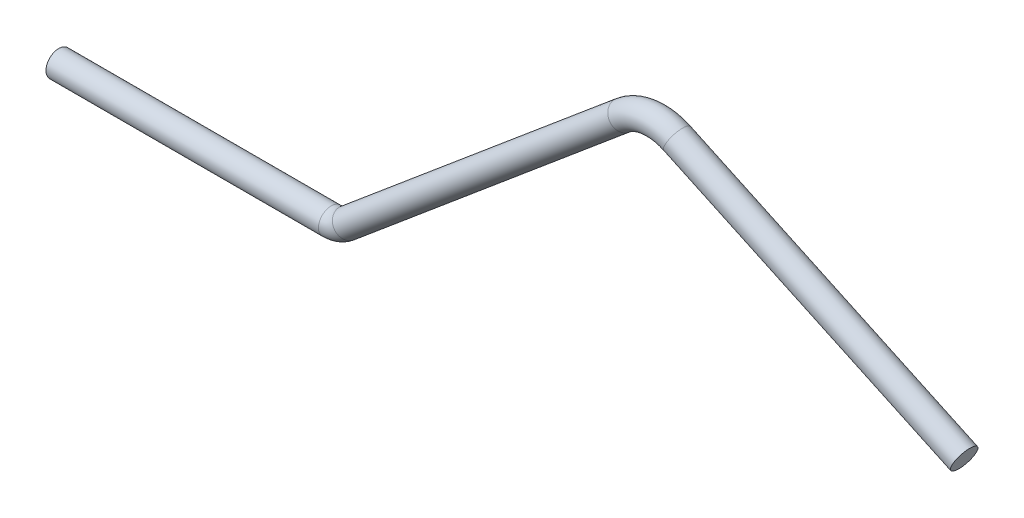
ISO-10303-21;
HEADER;
FILE_DESCRIPTION(('STEP AP214'),'2;1');
FILE_NAME('part.step','',(''),(''),'','','');
FILE_SCHEMA(('AUTOMOTIVE_DESIGN { 1 0 10303 214 1 1 1 1 }'));
ENDSEC;
DATA;
#1=APPLICATION_CONTEXT('core data for automotive mechanical design processes');
#2=APPLICATION_PROTOCOL_DEFINITION('international standard','automotive_design',2000,#1);
#3=PRODUCT_CONTEXT('',#1,'mechanical');
#4=PRODUCT('Part','Part','',(#3));
#5=PRODUCT_RELATED_PRODUCT_CATEGORY('part','',(#4));
#6=PRODUCT_DEFINITION_FORMATION('','',#4);
#7=PRODUCT_DEFINITION_CONTEXT('part definition',#1,'design');
#8=PRODUCT_DEFINITION('design','',#6,#7);
#9=PRODUCT_DEFINITION_SHAPE('','',#8);
#10=(LENGTH_UNIT() NAMED_UNIT(*) SI_UNIT(.MILLI.,.METRE.));
#11=(NAMED_UNIT(*) PLANE_ANGLE_UNIT() SI_UNIT($,.RADIAN.));
#12=(NAMED_UNIT(*) SI_UNIT($,.STERADIAN.) SOLID_ANGLE_UNIT());
#13=UNCERTAINTY_MEASURE_WITH_UNIT(LENGTH_MEASURE(1.E-05),#10,'distance_accuracy_value','');
#14=(GEOMETRIC_REPRESENTATION_CONTEXT(3) GLOBAL_UNCERTAINTY_ASSIGNED_CONTEXT((#13)) GLOBAL_UNIT_ASSIGNED_CONTEXT((#10,
#11,#12)) REPRESENTATION_CONTEXT('',''));
#15=CARTESIAN_POINT('',(0.,0.,0.));
#16=DIRECTION('',(0.,0.,1.));
#17=DIRECTION('',(1.,0.,0.));
#18=AXIS2_PLACEMENT_3D('',#15,#16,#17);
#19=CARTESIAN_POINT('',(112.281700632551,19.3315900551318,0.));
#20=DIRECTION('',(0.906307787036649,-0.422618261740701,0.));
#21=DIRECTION('',(0.,0.,-1.));
#22=AXIS2_PLACEMENT_3D('',#19,#20,#21);
#23=PLANE('',#22);
#24=CARTESIAN_POINT('',(112.281700632551,19.3315900551318,0.));
#25=DIRECTION('',(0.906307787036649,-0.422618261740701,0.));
#26=DIRECTION('',(0.,0.,-1.));
#27=AXIS2_PLACEMENT_3D('',#24,#25,#26);
#28=CIRCLE('',#27,2.);
#29=CARTESIAN_POINT('',(112.281700632551,19.3315900551318,-2.));
#30=VERTEX_POINT('',#29);
#31=EDGE_CURVE('E11',#30,#30,#28,.T.);
#32=ORIENTED_EDGE('',*,*,#31,.T.);
#33=EDGE_LOOP('',(#32));
#34=FACE_BOUND('',#33,.T.);
#35=ADVANCED_FACE('F33',(#34),#23,.T.);
#36=CARTESIAN_POINT('',(0.,2.,0.));
#37=DIRECTION('',(1.,0.,0.));
#38=DIRECTION('',(0.,0.,-1.));
#39=AXIS2_PLACEMENT_3D('',#36,#37,#38);
#40=CYLINDRICAL_SURFACE('',#39,2.);
#41=CARTESIAN_POINT('',(12.8161785944028,2.,0.));
#42=DIRECTION('',(1.,0.,0.));
#43=DIRECTION('',(0.,0.,-1.));
#44=AXIS2_PLACEMENT_3D('',#41,#42,#43);
#45=CIRCLE('',#44,2.);
#46=CARTESIAN_POINT('',(12.8161785944028,0.,0.));
#47=VERTEX_POINT('',#46);
#48=EDGE_CURVE('E58',#47,#47,#45,.T.);
#49=ORIENTED_EDGE('',*,*,#48,.F.);
#50=EDGE_LOOP('',(#49));
#51=FACE_BOUND('',#50,.T.);
#52=CARTESIAN_POINT('',(-30.,2.,0.));
#53=DIRECTION('',(1.,0.,0.));
#54=DIRECTION('',(0.,0.,-1.));
#55=AXIS2_PLACEMENT_3D('',#52,#53,#54);
#56=CIRCLE('',#55,2.);
#57=CARTESIAN_POINT('',(-30.,2.,-2.));
#58=VERTEX_POINT('',#57);
#59=EDGE_CURVE('E61',#58,#58,#56,.T.);
#60=ORIENTED_EDGE('',*,*,#59,.T.);
#61=EDGE_LOOP('',(#60));
#62=FACE_BOUND('',#61,.T.);
#63=ADVANCED_FACE('F65',(#51,#62),#40,.T.);
#64=CARTESIAN_POINT('',(12.8161785944028,6.,0.));
#65=DIRECTION('',(0.,0.,1.));
#66=DIRECTION('',(1.,0.,0.));
#67=AXIS2_PLACEMENT_3D('',#64,#65,#66);
#68=TOROIDAL_SURFACE('',#67,4.,2.);
#69=CARTESIAN_POINT('',(15.3873290331489,2.93582222752409,0.));
#70=DIRECTION('',(0.766044443118977,0.64278760968654,0.));
#71=DIRECTION('',(0.,0.,-1.));
#72=AXIS2_PLACEMENT_3D('',#69,#70,#71);
#73=CIRCLE('',#72,2.);
#74=CARTESIAN_POINT('',(16.672904252522,1.40373334128614,0.));
#75=VERTEX_POINT('',#74);
#76=EDGE_CURVE('E53',#75,#75,#73,.T.);
#77=CARTESIAN_POINT('',(12.8161785944028,6.,0.));
#78=DIRECTION('',(0.,0.,1.));
#79=DIRECTION('',(1.,0.,0.));
#80=AXIS2_PLACEMENT_3D('',#77,#78,#79);
#81=CIRCLE('',#80,6.);
#82=EDGE_CURVE('',#47,#75,#81,.T.);
#83=ORIENTED_EDGE('',*,*,#48,.T.);
#84=ORIENTED_EDGE('',*,*,#76,.F.);
#85=ORIENTED_EDGE('',*,*,#82,.T.);
#86=ORIENTED_EDGE('',*,*,#82,.F.);
#87=EDGE_LOOP('',(#83,#85,#84,#86));
#88=FACE_BOUND('',#87,.T.);
#89=ADVANCED_FACE('F76',(#88),#68,.T.);
#90=CARTESIAN_POINT('',(15.3873290331489,2.93582222752409,0.));
#91=DIRECTION('',(0.766044443118977,0.64278760968654,0.));
#92=DIRECTION('',(-0.64278760968654,0.766044443118977,0.));
#93=AXIS2_PLACEMENT_3D('',#90,#91,#92);
#94=CYLINDRICAL_SURFACE('',#93,2.);
#95=CARTESIAN_POINT('',(58.6548928897564,39.2416191015429,0.));
#96=DIRECTION('',(0.766044443118977,0.64278760968654,0.));
#97=DIRECTION('',(0.,0.,-1.));
#98=AXIS2_PLACEMENT_3D('',#95,#96,#97);
#99=CIRCLE('',#98,2.);
#100=CARTESIAN_POINT('',(57.3693176703833,40.7737079877809,0.));
#101=VERTEX_POINT('',#100);
#102=EDGE_CURVE('E51',#101,#101,#99,.T.);
#103=ORIENTED_EDGE('',*,*,#102,.F.);
#104=EDGE_LOOP('',(#103));
#105=FACE_BOUND('',#104,.T.);
#106=ORIENTED_EDGE('',*,*,#76,.T.);
#107=EDGE_LOOP('',(#106));
#108=FACE_BOUND('',#107,.T.);
#109=ADVANCED_FACE('F81',(#105,#108),#94,.T.);
#110=CARTESIAN_POINT('',(63.7971937672487,33.1132635565911,0.));
#111=DIRECTION('',(0.,0.,-1.));
#112=DIRECTION('',(-1.,0.,0.));
#113=AXIS2_PLACEMENT_3D('',#110,#111,#112);
#114=TOROIDAL_SURFACE('',#113,7.99999999999999,2.);
#115=CARTESIAN_POINT('',(67.1781398611743,40.3637258528843,0.));
#116=DIRECTION('',(0.906307787036649,-0.422618261740701,0.));
#117=DIRECTION('',(0.,0.,-1.));
#118=AXIS2_PLACEMENT_3D('',#115,#116,#117);
#119=CIRCLE('',#118,2.);
#120=CARTESIAN_POINT('',(68.0233763846557,42.1763414269576,0.));
#121=VERTEX_POINT('',#120);
#122=EDGE_CURVE('E39',#121,#121,#119,.T.);
#123=CARTESIAN_POINT('',(63.7971937672487,33.1132635565911,0.));
#124=DIRECTION('',(0.,0.,-1.));
#125=DIRECTION('',(-1.,0.,0.));
#126=AXIS2_PLACEMENT_3D('',#123,#124,#125);
#127=CIRCLE('',#126,9.99999999999999);
#128=EDGE_CURVE('',#101,#121,#127,.T.);
#129=ORIENTED_EDGE('',*,*,#102,.T.);
#130=ORIENTED_EDGE('',*,*,#122,.F.);
#131=ORIENTED_EDGE('',*,*,#128,.T.);
#132=ORIENTED_EDGE('',*,*,#128,.F.);
#133=EDGE_LOOP('',(#129,#131,#130,#132));
#134=FACE_BOUND('',#133,.T.);
#135=ADVANCED_FACE('F47',(#134),#114,.T.);
#136=CARTESIAN_POINT('',(67.1781398611743,40.3637258528843,0.));
#137=DIRECTION('',(0.906307787036649,-0.422618261740701,0.));
#138=DIRECTION('',(0.422618261740701,0.906307787036649,0.));
#139=AXIS2_PLACEMENT_3D('',#136,#137,#138);
#140=CYLINDRICAL_SURFACE('',#139,2.);
#141=ORIENTED_EDGE('',*,*,#31,.F.);
#142=EDGE_LOOP('',(#141));
#143=FACE_BOUND('',#142,.T.);
#144=ORIENTED_EDGE('',*,*,#122,.T.);
#145=EDGE_LOOP('',(#144));
#146=FACE_BOUND('',#145,.T.);
#147=ADVANCED_FACE('F43',(#143,#146),#140,.T.);
#148=CARTESIAN_POINT('',(-30.,2.,0.));
#149=DIRECTION('',(1.,0.,0.));
#150=DIRECTION('',(0.,0.,-1.));
#151=AXIS2_PLACEMENT_3D('',#148,#149,#150);
#152=PLANE('',#151);
#153=ORIENTED_EDGE('',*,*,#59,.F.);
#154=EDGE_LOOP('',(#153));
#155=FACE_BOUND('',#154,.T.);
#156=ADVANCED_FACE('F46',(#155),#152,.F.);
#157=CLOSED_SHELL('',(#35,#63,#89,#109,#135,#147,#156));
#158=MANIFOLD_SOLID_BREP('B2',#157);
#159=ADVANCED_BREP_SHAPE_REPRESENTATION('',(#18,#158),#14);
#160=SHAPE_DEFINITION_REPRESENTATION(#9,#159);
ENDSEC;
END-ISO-10303-21;
